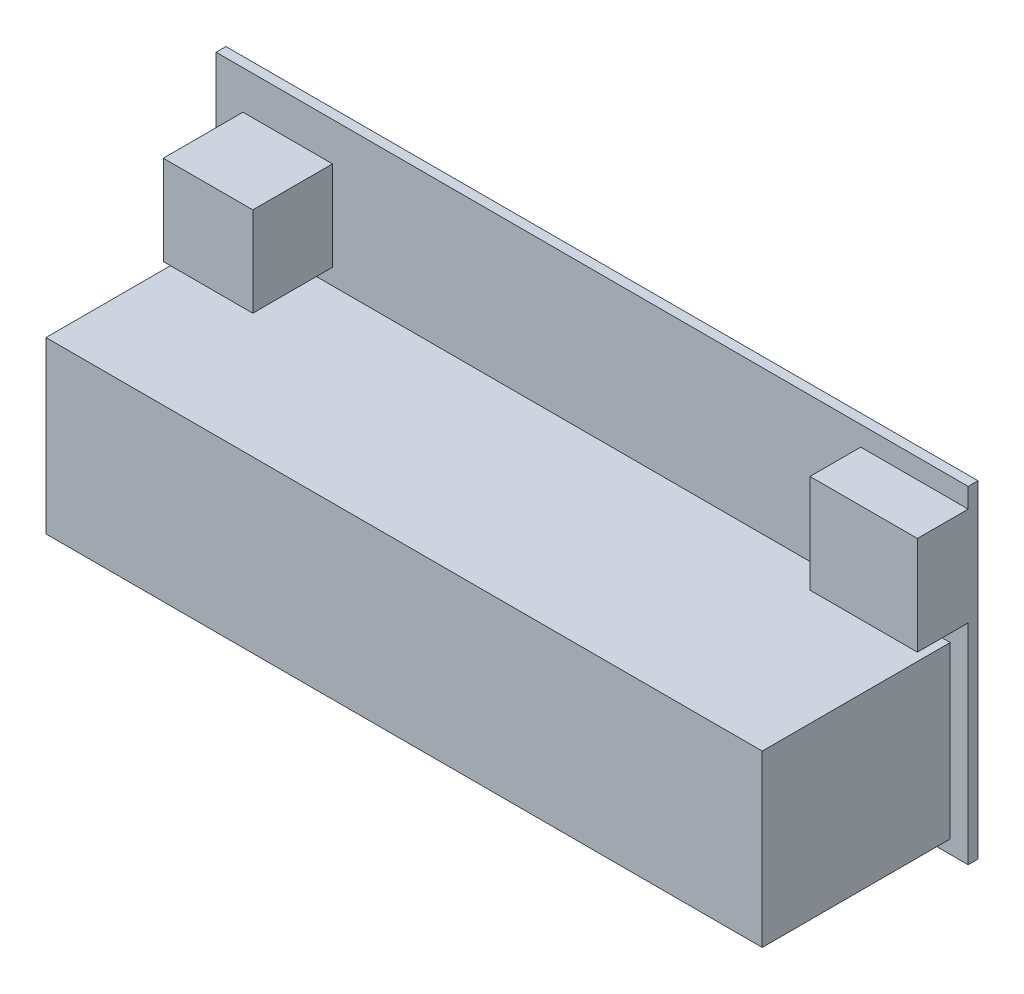
ISO-10303-21;
HEADER;
FILE_DESCRIPTION(('STEP AP214'),'2;1');
FILE_NAME('part.step','',(''),(''),'','','');
FILE_SCHEMA(('AUTOMOTIVE_DESIGN { 1 0 10303 214 1 1 1 1 }'));
ENDSEC;
DATA;
#1=APPLICATION_CONTEXT('core data for automotive mechanical design processes');
#2=APPLICATION_PROTOCOL_DEFINITION('international standard','automotive_design',2000,#1);
#3=PRODUCT_CONTEXT('',#1,'mechanical');
#4=PRODUCT('Part','Part','',(#3));
#5=PRODUCT_RELATED_PRODUCT_CATEGORY('part','',(#4));
#6=PRODUCT_DEFINITION_FORMATION('','',#4);
#7=PRODUCT_DEFINITION_CONTEXT('part definition',#1,'design');
#8=PRODUCT_DEFINITION('design','',#6,#7);
#9=PRODUCT_DEFINITION_SHAPE('','',#8);
#10=(LENGTH_UNIT() NAMED_UNIT(*) SI_UNIT(.MILLI.,.METRE.));
#11=(NAMED_UNIT(*) PLANE_ANGLE_UNIT() SI_UNIT($,.RADIAN.));
#12=(NAMED_UNIT(*) SI_UNIT($,.STERADIAN.) SOLID_ANGLE_UNIT());
#13=UNCERTAINTY_MEASURE_WITH_UNIT(LENGTH_MEASURE(1.E-05),#10,'distance_accuracy_value','');
#14=(GEOMETRIC_REPRESENTATION_CONTEXT(3) GLOBAL_UNCERTAINTY_ASSIGNED_CONTEXT((#13)) GLOBAL_UNIT_ASSIGNED_CONTEXT((#10,
#11,#12)) REPRESENTATION_CONTEXT('',''));
#15=CARTESIAN_POINT('',(0.,0.,0.));
#16=DIRECTION('',(0.,0.,1.));
#17=DIRECTION('',(1.,0.,0.));
#18=AXIS2_PLACEMENT_3D('',#15,#16,#17);
#19=CARTESIAN_POINT('',(0.,0.,1.1));
#20=DIRECTION('',(0.,0.,1.));
#21=DIRECTION('',(1.,0.,0.));
#22=AXIS2_PLACEMENT_3D('',#19,#20,#21);
#23=PLANE('',#22);
#24=DIRECTION('',(1.,0.,0.));
#25=VECTOR('',#24,1.);
#26=CARTESIAN_POINT('',(-24.6818710713896,-3.90422535211267,1.1));
#27=LINE('',#26,#25);
#28=CARTESIAN_POINT('',(-24.6818710713896,-3.90422535211267,1.1));
#29=VERTEX_POINT('',#28);
#30=CARTESIAN_POINT('',(-14.6818710713896,-3.90422535211267,1.1));
#31=VERTEX_POINT('',#30);
#32=EDGE_CURVE('E219',#29,#31,#27,.T.);
#33=ORIENTED_EDGE('',*,*,#32,.F.);
#34=DIRECTION('',(0.,-1.,0.));
#35=VECTOR('',#34,1.);
#36=CARTESIAN_POINT('',(-24.6818710713896,6.09577464788733,1.1));
#37=LINE('',#36,#35);
#38=CARTESIAN_POINT('',(-24.6818710713896,6.09577464788733,1.1));
#39=VERTEX_POINT('',#38);
#40=EDGE_CURVE('E205',#39,#29,#37,.T.);
#41=ORIENTED_EDGE('',*,*,#40,.F.);
#42=DIRECTION('',(-1.,0.,0.));
#43=VECTOR('',#42,1.);
#44=CARTESIAN_POINT('',(-24.6818710713896,6.09577464788733,1.1));
#45=LINE('',#44,#43);
#46=CARTESIAN_POINT('',(-14.6818710713896,6.09577464788733,1.1));
#47=VERTEX_POINT('',#46);
#48=EDGE_CURVE('E210',#47,#39,#45,.T.);
#49=ORIENTED_EDGE('',*,*,#48,.F.);
#50=DIRECTION('',(0.,1.,0.));
#51=VECTOR('',#50,1.);
#52=CARTESIAN_POINT('',(-14.6818710713896,6.09577464788733,1.1));
#53=LINE('',#52,#51);
#54=EDGE_CURVE('E221',#31,#47,#53,.T.);
#55=ORIENTED_EDGE('',*,*,#54,.F.);
#56=EDGE_LOOP('',(#33,#41,#49,#55));
#57=FACE_BOUND('',#56,.T.);
#58=DIRECTION('',(0.,1.,0.));
#59=VECTOR('',#58,1.);
#60=CARTESIAN_POINT('',(56.3181289286105,10.3957746478873,1.1));
#61=LINE('',#60,#59);
#62=CARTESIAN_POINT('',(56.3181289286105,-26.2042253521127,1.1));
#63=VERTEX_POINT('',#62);
#64=CARTESIAN_POINT('',(56.3181289286105,-2.80422535211267,1.1));
#65=VERTEX_POINT('',#64);
#66=EDGE_CURVE('E242',#63,#65,#61,.T.);
#67=ORIENTED_EDGE('',*,*,#66,.T.);
#68=DIRECTION('',(1.,0.,0.));
#69=VECTOR('',#68,1.);
#70=CARTESIAN_POINT('',(44.3181289286104,-2.80422535211267,1.1));
#71=LINE('',#70,#69);
#72=CARTESIAN_POINT('',(44.3181289286104,-2.80422535211267,1.1));
#73=VERTEX_POINT('',#72);
#74=EDGE_CURVE('E59',#73,#65,#71,.T.);
#75=ORIENTED_EDGE('',*,*,#74,.F.);
#76=DIRECTION('',(0.,-1.,0.));
#77=VECTOR('',#76,1.);
#78=CARTESIAN_POINT('',(44.3181289286104,8.19577464788733,1.1));
#79=LINE('',#78,#77);
#80=CARTESIAN_POINT('',(44.3181289286104,8.19577464788733,1.1));
#81=VERTEX_POINT('',#80);
#82=EDGE_CURVE('E174',#81,#73,#79,.T.);
#83=ORIENTED_EDGE('',*,*,#82,.F.);
#84=DIRECTION('',(-1.,0.,0.));
#85=VECTOR('',#84,1.);
#86=CARTESIAN_POINT('',(44.3181289286104,8.19577464788733,1.1));
#87=LINE('',#86,#85);
#88=CARTESIAN_POINT('',(56.3181289286105,8.19577464788733,1.1));
#89=VERTEX_POINT('',#88);
#90=EDGE_CURVE('E185',#89,#81,#87,.T.);
#91=ORIENTED_EDGE('',*,*,#90,.F.);
#92=CARTESIAN_POINT('',(56.3181289286105,10.3957746478873,1.1));
#93=VERTEX_POINT('',#92);
#94=EDGE_CURVE('E241',#89,#93,#61,.T.);
#95=ORIENTED_EDGE('',*,*,#94,.T.);
#96=DIRECTION('',(-1.,0.,0.));
#97=VECTOR('',#96,1.);
#98=CARTESIAN_POINT('',(-27.6818710713896,10.3957746478873,1.1));
#99=LINE('',#98,#97);
#100=CARTESIAN_POINT('',(-27.6818710713896,10.3957746478873,1.1));
#101=VERTEX_POINT('',#100);
#102=EDGE_CURVE('E244',#93,#101,#99,.T.);
#103=ORIENTED_EDGE('',*,*,#102,.T.);
#104=DIRECTION('',(0.,-1.,0.));
#105=VECTOR('',#104,1.);
#106=CARTESIAN_POINT('',(-27.6818710713896,10.3957746478873,1.1));
#107=LINE('',#106,#105);
#108=CARTESIAN_POINT('',(-27.6818710713896,-26.2042253521127,1.1));
#109=VERTEX_POINT('',#108);
#110=EDGE_CURVE('E235',#101,#109,#107,.T.);
#111=ORIENTED_EDGE('',*,*,#110,.T.);
#112=DIRECTION('',(1.,0.,0.));
#113=VECTOR('',#112,1.);
#114=CARTESIAN_POINT('',(-27.6818710713896,-26.2042253521127,1.1));
#115=LINE('',#114,#113);
#116=EDGE_CURVE('E238',#109,#63,#115,.T.);
#117=ORIENTED_EDGE('',*,*,#116,.T.);
#118=EDGE_LOOP('',(#67,#75,#83,#91,#95,#103,#111,#117));
#119=FACE_BOUND('',#118,.T.);
#120=DIRECTION('',(1.,0.,0.));
#121=VECTOR('',#120,1.);
#122=CARTESIAN_POINT('',(-25.6818710713896,-24.7042253521127,1.1));
#123=LINE('',#122,#121);
#124=CARTESIAN_POINT('',(-25.6818710713896,-24.7042253521127,1.1));
#125=VERTEX_POINT('',#124);
#126=CARTESIAN_POINT('',(54.3181289286105,-24.7042253521127,1.1));
#127=VERTEX_POINT('',#126);
#128=EDGE_CURVE('E461',#125,#127,#123,.T.);
#129=ORIENTED_EDGE('',*,*,#128,.F.);
#130=DIRECTION('',(0.,-1.,0.));
#131=VECTOR('',#130,1.);
#132=CARTESIAN_POINT('',(-25.6818710713896,-5.70422535211267,1.1));
#133=LINE('',#132,#131);
#134=CARTESIAN_POINT('',(-25.6818710713896,-5.70422535211267,1.1));
#135=VERTEX_POINT('',#134);
#136=EDGE_CURVE('E172',#135,#125,#133,.T.);
#137=ORIENTED_EDGE('',*,*,#136,.F.);
#138=DIRECTION('',(-1.,0.,0.));
#139=VECTOR('',#138,1.);
#140=CARTESIAN_POINT('',(-25.6818710713896,-5.70422535211267,1.1));
#141=LINE('',#140,#139);
#142=CARTESIAN_POINT('',(54.3181289286105,-5.70422535211267,1.1));
#143=VERTEX_POINT('',#142);
#144=EDGE_CURVE('E168',#143,#135,#141,.T.);
#145=ORIENTED_EDGE('',*,*,#144,.F.);
#146=DIRECTION('',(0.,1.,0.));
#147=VECTOR('',#146,1.);
#148=CARTESIAN_POINT('',(54.3181289286105,-5.70422535211267,1.1));
#149=LINE('',#148,#147);
#150=EDGE_CURVE('E458',#127,#143,#149,.T.);
#151=ORIENTED_EDGE('',*,*,#150,.F.);
#152=EDGE_LOOP('',(#129,#137,#145,#151));
#153=FACE_BOUND('',#152,.T.);
#154=ADVANCED_FACE('F36',(#57,#119,#153),#23,.T.);
#155=CARTESIAN_POINT('',(-27.6818710713896,10.3957746478873,1.1));
#156=DIRECTION('',(1.,0.,0.));
#157=DIRECTION('',(0.,1.,0.));
#158=AXIS2_PLACEMENT_3D('',#155,#156,#157);
#159=PLANE('',#158);
#160=DIRECTION('',(0.,-1.,0.));
#161=VECTOR('',#160,1.);
#162=CARTESIAN_POINT('',(-27.6818710713896,10.3957746478873,0.));
#163=LINE('',#162,#161);
#164=CARTESIAN_POINT('',(-27.6818710713896,10.3957746478873,0.));
#165=VERTEX_POINT('',#164);
#166=CARTESIAN_POINT('',(-27.6818710713896,-26.2042253521127,0.));
#167=VERTEX_POINT('',#166);
#168=EDGE_CURVE('E234',#165,#167,#163,.T.);
#169=ORIENTED_EDGE('',*,*,#168,.T.);
#170=DIRECTION('',(0.,0.,-1.));
#171=VECTOR('',#170,1.);
#172=CARTESIAN_POINT('',(-27.6818710713896,-26.2042253521127,1.1));
#173=LINE('',#172,#171);
#174=EDGE_CURVE('E11',#109,#167,#173,.T.);
#175=ORIENTED_EDGE('',*,*,#174,.F.);
#176=ORIENTED_EDGE('',*,*,#110,.F.);
#177=DIRECTION('',(0.,0.,-1.));
#178=VECTOR('',#177,1.);
#179=CARTESIAN_POINT('',(-27.6818710713896,10.3957746478873,1.1));
#180=LINE('',#179,#178);
#181=EDGE_CURVE('E246',#101,#165,#180,.T.);
#182=ORIENTED_EDGE('',*,*,#181,.T.);
#183=EDGE_LOOP('',(#169,#175,#176,#182));
#184=FACE_BOUND('',#183,.T.);
#185=ADVANCED_FACE('F38',(#184),#159,.F.);
#186=CARTESIAN_POINT('',(-27.6818710713896,-26.2042253521127,1.1));
#187=DIRECTION('',(0.,1.,0.));
#188=DIRECTION('',(0.,0.,1.));
#189=AXIS2_PLACEMENT_3D('',#186,#187,#188);
#190=PLANE('',#189);
#191=DIRECTION('',(1.,0.,0.));
#192=VECTOR('',#191,1.);
#193=CARTESIAN_POINT('',(-27.6818710713896,-26.2042253521127,0.));
#194=LINE('',#193,#192);
#195=CARTESIAN_POINT('',(56.3181289286105,-26.2042253521127,0.));
#196=VERTEX_POINT('',#195);
#197=EDGE_CURVE('E249',#167,#196,#194,.T.);
#198=ORIENTED_EDGE('',*,*,#197,.T.);
#199=DIRECTION('',(0.,0.,-1.));
#200=VECTOR('',#199,1.);
#201=CARTESIAN_POINT('',(56.3181289286105,-26.2042253521127,1.1));
#202=LINE('',#201,#200);
#203=EDGE_CURVE('E44',#63,#196,#202,.T.);
#204=ORIENTED_EDGE('',*,*,#203,.F.);
#205=ORIENTED_EDGE('',*,*,#116,.F.);
#206=ORIENTED_EDGE('',*,*,#174,.T.);
#207=EDGE_LOOP('',(#198,#204,#205,#206));
#208=FACE_BOUND('',#207,.T.);
#209=ADVANCED_FACE('F311',(#208),#190,.F.);
#210=CARTESIAN_POINT('',(56.3181289286105,10.3957746478873,1.1));
#211=DIRECTION('',(-1.,0.,0.));
#212=DIRECTION('',(0.,0.,1.));
#213=AXIS2_PLACEMENT_3D('',#210,#211,#212);
#214=PLANE('',#213);
#215=DIRECTION('',(0.,1.,0.));
#216=VECTOR('',#215,1.);
#217=CARTESIAN_POINT('',(56.3181289286105,10.3957746478873,0.));
#218=LINE('',#217,#216);
#219=CARTESIAN_POINT('',(56.3181289286105,10.3957746478873,0.));
#220=VERTEX_POINT('',#219);
#221=EDGE_CURVE('E251',#196,#220,#218,.T.);
#222=ORIENTED_EDGE('',*,*,#221,.T.);
#223=DIRECTION('',(0.,0.,-1.));
#224=VECTOR('',#223,1.);
#225=CARTESIAN_POINT('',(56.3181289286105,10.3957746478873,1.1));
#226=LINE('',#225,#224);
#227=EDGE_CURVE('E256',#93,#220,#226,.T.);
#228=ORIENTED_EDGE('',*,*,#227,.F.);
#229=ORIENTED_EDGE('',*,*,#94,.F.);
#230=DIRECTION('',(0.,0.,-1.));
#231=VECTOR('',#230,1.);
#232=CARTESIAN_POINT('',(56.3181289286105,8.19577464788733,6.77));
#233=LINE('',#232,#231);
#234=CARTESIAN_POINT('',(56.3181289286105,8.19577464788733,6.77));
#235=VERTEX_POINT('',#234);
#236=EDGE_CURVE('E197',#235,#89,#233,.T.);
#237=ORIENTED_EDGE('',*,*,#236,.F.);
#238=DIRECTION('',(0.,1.,0.));
#239=VECTOR('',#238,1.);
#240=CARTESIAN_POINT('',(56.3181289286105,8.19577464788733,6.77));
#241=LINE('',#240,#239);
#242=CARTESIAN_POINT('',(56.3181289286105,-2.80422535211267,6.77));
#243=VERTEX_POINT('',#242);
#244=EDGE_CURVE('E187',#243,#235,#241,.T.);
#245=ORIENTED_EDGE('',*,*,#244,.F.);
#246=DIRECTION('',(0.,0.,-1.));
#247=VECTOR('',#246,1.);
#248=CARTESIAN_POINT('',(56.3181289286105,-2.80422535211267,6.77));
#249=LINE('',#248,#247);
#250=EDGE_CURVE('E200',#243,#65,#249,.T.);
#251=ORIENTED_EDGE('',*,*,#250,.T.);
#252=ORIENTED_EDGE('',*,*,#66,.F.);
#253=ORIENTED_EDGE('',*,*,#203,.T.);
#254=EDGE_LOOP('',(#222,#228,#229,#237,#245,#251,#252,#253));
#255=FACE_BOUND('',#254,.T.);
#256=ADVANCED_FACE('F263',(#255),#214,.F.);
#257=CARTESIAN_POINT('',(-27.6818710713896,10.3957746478873,1.1));
#258=DIRECTION('',(0.,-1.,0.));
#259=DIRECTION('',(1.,0.,0.));
#260=AXIS2_PLACEMENT_3D('',#257,#258,#259);
#261=PLANE('',#260);
#262=DIRECTION('',(-1.,0.,0.));
#263=VECTOR('',#262,1.);
#264=CARTESIAN_POINT('',(-27.6818710713896,10.3957746478873,0.));
#265=LINE('',#264,#263);
#266=EDGE_CURVE('E239',#220,#165,#265,.T.);
#267=ORIENTED_EDGE('',*,*,#266,.T.);
#268=ORIENTED_EDGE('',*,*,#181,.F.);
#269=ORIENTED_EDGE('',*,*,#102,.F.);
#270=ORIENTED_EDGE('',*,*,#227,.T.);
#271=EDGE_LOOP('',(#267,#268,#269,#270));
#272=FACE_BOUND('',#271,.T.);
#273=ADVANCED_FACE('F272',(#272),#261,.F.);
#274=CARTESIAN_POINT('',(0.,0.,0.));
#275=DIRECTION('',(0.,0.,1.));
#276=DIRECTION('',(1.,0.,0.));
#277=AXIS2_PLACEMENT_3D('',#274,#275,#276);
#278=PLANE('',#277);
#279=ORIENTED_EDGE('',*,*,#168,.F.);
#280=ORIENTED_EDGE('',*,*,#266,.F.);
#281=ORIENTED_EDGE('',*,*,#221,.F.);
#282=ORIENTED_EDGE('',*,*,#197,.F.);
#283=EDGE_LOOP('',(#279,#280,#281,#282));
#284=FACE_BOUND('',#283,.T.);
#285=ADVANCED_FACE('F269',(#284),#278,.F.);
#286=CARTESIAN_POINT('',(-24.6818710713896,6.09577464788733,10.));
#287=DIRECTION('',(1.,0.,0.));
#288=DIRECTION('',(0.,0.,-1.));
#289=AXIS2_PLACEMENT_3D('',#286,#287,#288);
#290=PLANE('',#289);
#291=ORIENTED_EDGE('',*,*,#40,.T.);
#292=DIRECTION('',(0.,0.,-1.));
#293=VECTOR('',#292,1.);
#294=CARTESIAN_POINT('',(-24.6818710713896,-3.90422535211267,10.));
#295=LINE('',#294,#293);
#296=CARTESIAN_POINT('',(-24.6818710713896,-3.90422535211267,10.));
#297=VERTEX_POINT('',#296);
#298=EDGE_CURVE('E232',#297,#29,#295,.T.);
#299=ORIENTED_EDGE('',*,*,#298,.F.);
#300=DIRECTION('',(0.,-1.,0.));
#301=VECTOR('',#300,1.);
#302=CARTESIAN_POINT('',(-24.6818710713896,6.09577464788733,10.));
#303=LINE('',#302,#301);
#304=CARTESIAN_POINT('',(-24.6818710713896,6.09577464788733,10.));
#305=VERTEX_POINT('',#304);
#306=EDGE_CURVE('E206',#305,#297,#303,.T.);
#307=ORIENTED_EDGE('',*,*,#306,.F.);
#308=DIRECTION('',(0.,0.,-1.));
#309=VECTOR('',#308,1.);
#310=CARTESIAN_POINT('',(-24.6818710713896,6.09577464788733,10.));
#311=LINE('',#310,#309);
#312=EDGE_CURVE('E216',#305,#39,#311,.T.);
#313=ORIENTED_EDGE('',*,*,#312,.T.);
#314=EDGE_LOOP('',(#291,#299,#307,#313));
#315=FACE_BOUND('',#314,.T.);
#316=ADVANCED_FACE('F315',(#315),#290,.F.);
#317=CARTESIAN_POINT('',(-24.6818710713896,-3.90422535211267,10.));
#318=DIRECTION('',(0.,1.,0.));
#319=DIRECTION('',(0.,0.,1.));
#320=AXIS2_PLACEMENT_3D('',#317,#318,#319);
#321=PLANE('',#320);
#322=ORIENTED_EDGE('',*,*,#32,.T.);
#323=DIRECTION('',(0.,0.,-1.));
#324=VECTOR('',#323,1.);
#325=CARTESIAN_POINT('',(-14.6818710713896,-3.90422535211267,10.));
#326=LINE('',#325,#324);
#327=CARTESIAN_POINT('',(-14.6818710713896,-3.90422535211267,10.));
#328=VERTEX_POINT('',#327);
#329=EDGE_CURVE('E229',#328,#31,#326,.T.);
#330=ORIENTED_EDGE('',*,*,#329,.F.);
#331=DIRECTION('',(1.,0.,0.));
#332=VECTOR('',#331,1.);
#333=CARTESIAN_POINT('',(-24.6818710713896,-3.90422535211267,10.));
#334=LINE('',#333,#332);
#335=EDGE_CURVE('E209',#297,#328,#334,.T.);
#336=ORIENTED_EDGE('',*,*,#335,.F.);
#337=ORIENTED_EDGE('',*,*,#298,.T.);
#338=EDGE_LOOP('',(#322,#330,#336,#337));
#339=FACE_BOUND('',#338,.T.);
#340=ADVANCED_FACE('F346',(#339),#321,.F.);
#341=CARTESIAN_POINT('',(-14.6818710713896,6.09577464788733,10.));
#342=DIRECTION('',(-1.,0.,0.));
#343=DIRECTION('',(0.,-1.,0.));
#344=AXIS2_PLACEMENT_3D('',#341,#342,#343);
#345=PLANE('',#344);
#346=ORIENTED_EDGE('',*,*,#54,.T.);
#347=DIRECTION('',(0.,0.,-1.));
#348=VECTOR('',#347,1.);
#349=CARTESIAN_POINT('',(-14.6818710713896,6.09577464788733,10.));
#350=LINE('',#349,#348);
#351=CARTESIAN_POINT('',(-14.6818710713896,6.09577464788733,10.));
#352=VERTEX_POINT('',#351);
#353=EDGE_CURVE('E227',#352,#47,#350,.T.);
#354=ORIENTED_EDGE('',*,*,#353,.F.);
#355=DIRECTION('',(0.,1.,0.));
#356=VECTOR('',#355,1.);
#357=CARTESIAN_POINT('',(-14.6818710713896,6.09577464788733,10.));
#358=LINE('',#357,#356);
#359=EDGE_CURVE('E212',#328,#352,#358,.T.);
#360=ORIENTED_EDGE('',*,*,#359,.F.);
#361=ORIENTED_EDGE('',*,*,#329,.T.);
#362=EDGE_LOOP('',(#346,#354,#360,#361));
#363=FACE_BOUND('',#362,.T.);
#364=ADVANCED_FACE('F353',(#363),#345,.F.);
#365=CARTESIAN_POINT('',(-24.6818710713896,6.09577464788733,10.));
#366=DIRECTION('',(0.,-1.,0.));
#367=DIRECTION('',(0.,0.,-1.));
#368=AXIS2_PLACEMENT_3D('',#365,#366,#367);
#369=PLANE('',#368);
#370=ORIENTED_EDGE('',*,*,#48,.T.);
#371=ORIENTED_EDGE('',*,*,#312,.F.);
#372=DIRECTION('',(-1.,0.,0.));
#373=VECTOR('',#372,1.);
#374=CARTESIAN_POINT('',(-24.6818710713896,6.09577464788733,10.));
#375=LINE('',#374,#373);
#376=EDGE_CURVE('E214',#352,#305,#375,.T.);
#377=ORIENTED_EDGE('',*,*,#376,.F.);
#378=ORIENTED_EDGE('',*,*,#353,.T.);
#379=EDGE_LOOP('',(#370,#371,#377,#378));
#380=FACE_BOUND('',#379,.T.);
#381=ADVANCED_FACE('F302',(#380),#369,.F.);
#382=CARTESIAN_POINT('',(0.,0.,10.));
#383=DIRECTION('',(0.,0.,1.));
#384=DIRECTION('',(1.,0.,0.));
#385=AXIS2_PLACEMENT_3D('',#382,#383,#384);
#386=PLANE('',#385);
#387=ORIENTED_EDGE('',*,*,#306,.T.);
#388=ORIENTED_EDGE('',*,*,#335,.T.);
#389=ORIENTED_EDGE('',*,*,#359,.T.);
#390=ORIENTED_EDGE('',*,*,#376,.T.);
#391=EDGE_LOOP('',(#387,#388,#389,#390));
#392=FACE_BOUND('',#391,.T.);
#393=ADVANCED_FACE('F295',(#392),#386,.T.);
#394=CARTESIAN_POINT('',(44.3181289286104,8.19577464788733,6.77));
#395=DIRECTION('',(1.,0.,0.));
#396=DIRECTION('',(0.,0.,-1.));
#397=AXIS2_PLACEMENT_3D('',#394,#395,#396);
#398=PLANE('',#397);
#399=ORIENTED_EDGE('',*,*,#82,.T.);
#400=DIRECTION('',(0.,0.,-1.));
#401=VECTOR('',#400,1.);
#402=CARTESIAN_POINT('',(44.3181289286104,-2.80422535211267,6.77));
#403=LINE('',#402,#401);
#404=CARTESIAN_POINT('',(44.3181289286104,-2.80422535211267,6.77));
#405=VERTEX_POINT('',#404);
#406=EDGE_CURVE('E203',#405,#73,#403,.T.);
#407=ORIENTED_EDGE('',*,*,#406,.F.);
#408=DIRECTION('',(0.,-1.,0.));
#409=VECTOR('',#408,1.);
#410=CARTESIAN_POINT('',(44.3181289286104,8.19577464788733,6.77));
#411=LINE('',#410,#409);
#412=CARTESIAN_POINT('',(44.3181289286104,8.19577464788733,6.77));
#413=VERTEX_POINT('',#412);
#414=EDGE_CURVE('E181',#413,#405,#411,.T.);
#415=ORIENTED_EDGE('',*,*,#414,.F.);
#416=DIRECTION('',(0.,0.,-1.));
#417=VECTOR('',#416,1.);
#418=CARTESIAN_POINT('',(44.3181289286104,8.19577464788733,6.77));
#419=LINE('',#418,#417);
#420=EDGE_CURVE('E190',#413,#81,#419,.T.);
#421=ORIENTED_EDGE('',*,*,#420,.T.);
#422=EDGE_LOOP('',(#399,#407,#415,#421));
#423=FACE_BOUND('',#422,.T.);
#424=ADVANCED_FACE('F293',(#423),#398,.F.);
#425=CARTESIAN_POINT('',(44.3181289286104,-2.80422535211267,6.77));
#426=DIRECTION('',(0.,1.,0.));
#427=DIRECTION('',(0.,0.,1.));
#428=AXIS2_PLACEMENT_3D('',#425,#426,#427);
#429=PLANE('',#428);
#430=ORIENTED_EDGE('',*,*,#74,.T.);
#431=ORIENTED_EDGE('',*,*,#250,.F.);
#432=DIRECTION('',(1.,0.,0.));
#433=VECTOR('',#432,1.);
#434=CARTESIAN_POINT('',(44.3181289286104,-2.80422535211267,6.77));
#435=LINE('',#434,#433);
#436=EDGE_CURVE('E184',#405,#243,#435,.T.);
#437=ORIENTED_EDGE('',*,*,#436,.F.);
#438=ORIENTED_EDGE('',*,*,#406,.T.);
#439=EDGE_LOOP('',(#430,#431,#437,#438));
#440=FACE_BOUND('',#439,.T.);
#441=ADVANCED_FACE('F291',(#440),#429,.F.);
#442=CARTESIAN_POINT('',(44.3181289286104,8.19577464788733,6.77));
#443=DIRECTION('',(0.,-1.,0.));
#444=DIRECTION('',(0.,0.,-1.));
#445=AXIS2_PLACEMENT_3D('',#442,#443,#444);
#446=PLANE('',#445);
#447=ORIENTED_EDGE('',*,*,#90,.T.);
#448=ORIENTED_EDGE('',*,*,#420,.F.);
#449=DIRECTION('',(-1.,0.,0.));
#450=VECTOR('',#449,1.);
#451=CARTESIAN_POINT('',(44.3181289286104,8.19577464788733,6.77));
#452=LINE('',#451,#450);
#453=EDGE_CURVE('E189',#235,#413,#452,.T.);
#454=ORIENTED_EDGE('',*,*,#453,.F.);
#455=ORIENTED_EDGE('',*,*,#236,.T.);
#456=EDGE_LOOP('',(#447,#448,#454,#455));
#457=FACE_BOUND('',#456,.T.);
#458=ADVANCED_FACE('F284',(#457),#446,.F.);
#459=CARTESIAN_POINT('',(0.,0.,6.77));
#460=DIRECTION('',(0.,0.,1.));
#461=DIRECTION('',(1.,0.,0.));
#462=AXIS2_PLACEMENT_3D('',#459,#460,#461);
#463=PLANE('',#462);
#464=ORIENTED_EDGE('',*,*,#414,.T.);
#465=ORIENTED_EDGE('',*,*,#436,.T.);
#466=ORIENTED_EDGE('',*,*,#244,.T.);
#467=ORIENTED_EDGE('',*,*,#453,.T.);
#468=EDGE_LOOP('',(#464,#465,#466,#467));
#469=FACE_BOUND('',#468,.T.);
#470=ADVANCED_FACE('F287',(#469),#463,.T.);
#471=CARTESIAN_POINT('',(-25.6818710713896,-5.70422535211267,22.1));
#472=DIRECTION('',(1.,0.,0.));
#473=DIRECTION('',(0.,0.,-1.));
#474=AXIS2_PLACEMENT_3D('',#471,#472,#473);
#475=PLANE('',#474);
#476=ORIENTED_EDGE('',*,*,#136,.T.);
#477=DIRECTION('',(0.,0.,-1.));
#478=VECTOR('',#477,1.);
#479=CARTESIAN_POINT('',(-25.6818710713896,-24.7042253521127,22.1));
#480=LINE('',#479,#478);
#481=CARTESIAN_POINT('',(-25.6818710713896,-24.7042253521127,22.1));
#482=VERTEX_POINT('',#481);
#483=EDGE_CURVE('E153',#482,#125,#480,.T.);
#484=ORIENTED_EDGE('',*,*,#483,.F.);
#485=DIRECTION('',(0.,-1.,0.));
#486=VECTOR('',#485,1.);
#487=CARTESIAN_POINT('',(-25.6818710713896,-5.70422535211267,22.1));
#488=LINE('',#487,#486);
#489=CARTESIAN_POINT('',(-25.6818710713896,-5.70422535211267,22.1));
#490=VERTEX_POINT('',#489);
#491=EDGE_CURVE('E160',#490,#482,#488,.T.);
#492=ORIENTED_EDGE('',*,*,#491,.F.);
#493=DIRECTION('',(0.,0.,-1.));
#494=VECTOR('',#493,1.);
#495=CARTESIAN_POINT('',(-25.6818710713896,-5.70422535211267,22.1));
#496=LINE('',#495,#494);
#497=EDGE_CURVE('E456',#490,#135,#496,.T.);
#498=ORIENTED_EDGE('',*,*,#497,.T.);
#499=EDGE_LOOP('',(#476,#484,#492,#498));
#500=FACE_BOUND('',#499,.T.);
#501=ADVANCED_FACE('F170',(#500),#475,.F.);
#502=CARTESIAN_POINT('',(-25.6818710713896,-24.7042253521127,22.1));
#503=DIRECTION('',(0.,1.,0.));
#504=DIRECTION('',(0.,0.,1.));
#505=AXIS2_PLACEMENT_3D('',#502,#503,#504);
#506=PLANE('',#505);
#507=ORIENTED_EDGE('',*,*,#128,.T.);
#508=DIRECTION('',(0.,0.,-1.));
#509=VECTOR('',#508,1.);
#510=CARTESIAN_POINT('',(54.3181289286105,-24.7042253521127,22.1));
#511=LINE('',#510,#509);
#512=CARTESIAN_POINT('',(54.3181289286105,-24.7042253521127,22.1));
#513=VERTEX_POINT('',#512);
#514=EDGE_CURVE('E156',#513,#127,#511,.T.);
#515=ORIENTED_EDGE('',*,*,#514,.F.);
#516=DIRECTION('',(1.,0.,0.));
#517=VECTOR('',#516,1.);
#518=CARTESIAN_POINT('',(-25.6818710713896,-24.7042253521127,22.1));
#519=LINE('',#518,#517);
#520=EDGE_CURVE('E149',#482,#513,#519,.T.);
#521=ORIENTED_EDGE('',*,*,#520,.F.);
#522=ORIENTED_EDGE('',*,*,#483,.T.);
#523=EDGE_LOOP('',(#507,#515,#521,#522));
#524=FACE_BOUND('',#523,.T.);
#525=ADVANCED_FACE('F151',(#524),#506,.F.);
#526=CARTESIAN_POINT('',(54.3181289286105,-5.70422535211267,22.1));
#527=DIRECTION('',(-1.,0.,0.));
#528=DIRECTION('',(0.,0.,1.));
#529=AXIS2_PLACEMENT_3D('',#526,#527,#528);
#530=PLANE('',#529);
#531=ORIENTED_EDGE('',*,*,#150,.T.);
#532=DIRECTION('',(0.,0.,-1.));
#533=VECTOR('',#532,1.);
#534=CARTESIAN_POINT('',(54.3181289286105,-5.70422535211267,22.1));
#535=LINE('',#534,#533);
#536=CARTESIAN_POINT('',(54.3181289286105,-5.70422535211267,22.1));
#537=VERTEX_POINT('',#536);
#538=EDGE_CURVE('E51',#537,#143,#535,.T.);
#539=ORIENTED_EDGE('',*,*,#538,.F.);
#540=DIRECTION('',(0.,1.,0.));
#541=VECTOR('',#540,1.);
#542=CARTESIAN_POINT('',(54.3181289286105,-5.70422535211267,22.1));
#543=LINE('',#542,#541);
#544=EDGE_CURVE('E159',#513,#537,#543,.T.);
#545=ORIENTED_EDGE('',*,*,#544,.F.);
#546=ORIENTED_EDGE('',*,*,#514,.T.);
#547=EDGE_LOOP('',(#531,#539,#545,#546));
#548=FACE_BOUND('',#547,.T.);
#549=ADVANCED_FACE('F422',(#548),#530,.F.);
#550=CARTESIAN_POINT('',(-25.6818710713896,-5.70422535211267,22.1));
#551=DIRECTION('',(0.,-1.,0.));
#552=DIRECTION('',(0.,0.,-1.));
#553=AXIS2_PLACEMENT_3D('',#550,#551,#552);
#554=PLANE('',#553);
#555=ORIENTED_EDGE('',*,*,#144,.T.);
#556=ORIENTED_EDGE('',*,*,#497,.F.);
#557=DIRECTION('',(-1.,0.,0.));
#558=VECTOR('',#557,1.);
#559=CARTESIAN_POINT('',(-25.6818710713896,-5.70422535211267,22.1));
#560=LINE('',#559,#558);
#561=EDGE_CURVE('E164',#537,#490,#560,.T.);
#562=ORIENTED_EDGE('',*,*,#561,.F.);
#563=ORIENTED_EDGE('',*,*,#538,.T.);
#564=EDGE_LOOP('',(#555,#556,#562,#563));
#565=FACE_BOUND('',#564,.T.);
#566=ADVANCED_FACE('F430',(#565),#554,.F.);
#567=CARTESIAN_POINT('',(0.,0.,22.1));
#568=DIRECTION('',(0.,0.,1.));
#569=DIRECTION('',(1.,0.,0.));
#570=AXIS2_PLACEMENT_3D('',#567,#568,#569);
#571=PLANE('',#570);
#572=ORIENTED_EDGE('',*,*,#491,.T.);
#573=ORIENTED_EDGE('',*,*,#520,.T.);
#574=ORIENTED_EDGE('',*,*,#544,.T.);
#575=ORIENTED_EDGE('',*,*,#561,.T.);
#576=EDGE_LOOP('',(#572,#573,#574,#575));
#577=FACE_BOUND('',#576,.T.);
#578=ADVANCED_FACE('F163',(#577),#571,.T.);
#579=CLOSED_SHELL('',(#154,#185,#209,#256,#273,#285,#316,#340,#364,#381,#393,#424,#441,#458,
#470,#501,#525,#549,#566,#578));
#580=MANIFOLD_SOLID_BREP('B2',#579);
#581=ADVANCED_BREP_SHAPE_REPRESENTATION('',(#18,#580),#14);
#582=SHAPE_DEFINITION_REPRESENTATION(#9,#581);
ENDSEC;
END-ISO-10303-21;
